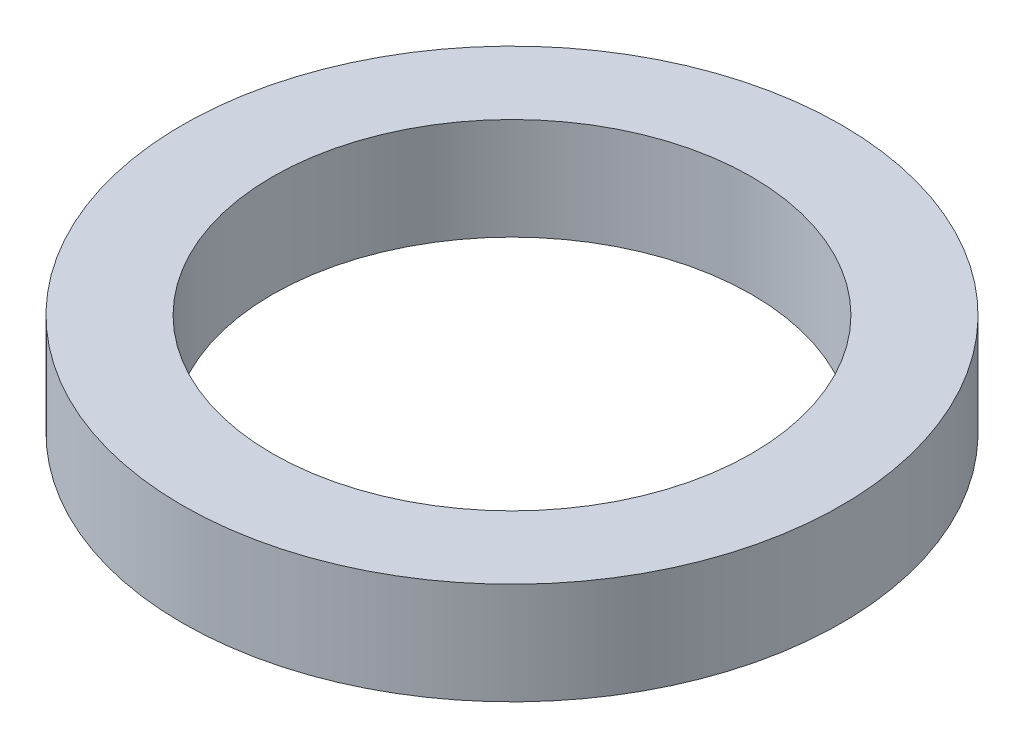
ISO-10303-21;
HEADER;
FILE_DESCRIPTION(('STEP AP214'),'2;1');
FILE_NAME('part.step','',(''),(''),'','','');
FILE_SCHEMA(('AUTOMOTIVE_DESIGN { 1 0 10303 214 1 1 1 1 }'));
ENDSEC;
DATA;
#1=APPLICATION_CONTEXT('core data for automotive mechanical design processes');
#2=APPLICATION_PROTOCOL_DEFINITION('international standard','automotive_design',2000,#1);
#3=PRODUCT_CONTEXT('',#1,'mechanical');
#4=PRODUCT('Part','Part','',(#3));
#5=PRODUCT_RELATED_PRODUCT_CATEGORY('part','',(#4));
#6=PRODUCT_DEFINITION_FORMATION('','',#4);
#7=PRODUCT_DEFINITION_CONTEXT('part definition',#1,'design');
#8=PRODUCT_DEFINITION('design','',#6,#7);
#9=PRODUCT_DEFINITION_SHAPE('','',#8);
#10=(LENGTH_UNIT() NAMED_UNIT(*) SI_UNIT(.MILLI.,.METRE.));
#11=(NAMED_UNIT(*) PLANE_ANGLE_UNIT() SI_UNIT($,.RADIAN.));
#12=(NAMED_UNIT(*) SI_UNIT($,.STERADIAN.) SOLID_ANGLE_UNIT());
#13=UNCERTAINTY_MEASURE_WITH_UNIT(LENGTH_MEASURE(1.E-05),#10,'distance_accuracy_value','');
#14=(GEOMETRIC_REPRESENTATION_CONTEXT(3) GLOBAL_UNCERTAINTY_ASSIGNED_CONTEXT((#13)) GLOBAL_UNIT_ASSIGNED_CONTEXT((#10,
#11,#12)) REPRESENTATION_CONTEXT('',''));
#15=CARTESIAN_POINT('',(0.,0.,0.));
#16=DIRECTION('',(0.,0.,1.));
#17=DIRECTION('',(1.,0.,0.));
#18=AXIS2_PLACEMENT_3D('',#15,#16,#17);
#19=CARTESIAN_POINT('',(0.,1.7,0.));
#20=DIRECTION('',(0.,1.,0.));
#21=DIRECTION('',(0.,0.,1.));
#22=AXIS2_PLACEMENT_3D('',#19,#20,#21);
#23=PLANE('',#22);
#24=CARTESIAN_POINT('',(0.,1.7,0.));
#25=DIRECTION('',(0.,1.,0.));
#26=DIRECTION('',(0.,0.,1.));
#27=AXIS2_PLACEMENT_3D('',#24,#25,#26);
#28=CIRCLE('',#27,5.5);
#29=CARTESIAN_POINT('',(0.,1.7,5.5));
#30=VERTEX_POINT('',#29);
#31=EDGE_CURVE('E10',#30,#30,#28,.T.);
#32=ORIENTED_EDGE('',*,*,#31,.T.);
#33=EDGE_LOOP('',(#32));
#34=FACE_BOUND('',#33,.T.);
#35=CARTESIAN_POINT('',(0.,1.7,0.));
#36=DIRECTION('',(0.,1.,0.));
#37=DIRECTION('',(0.,0.,1.));
#38=AXIS2_PLACEMENT_3D('',#35,#36,#37);
#39=CIRCLE('',#38,4.);
#40=CARTESIAN_POINT('',(0.,1.7,4.));
#41=VERTEX_POINT('',#40);
#42=EDGE_CURVE('E44',#41,#41,#39,.T.);
#43=ORIENTED_EDGE('',*,*,#42,.F.);
#44=EDGE_LOOP('',(#43));
#45=FACE_BOUND('',#44,.T.);
#46=ADVANCED_FACE('F33',(#34,#45),#23,.T.);
#47=CARTESIAN_POINT('',(0.,0.,0.));
#48=DIRECTION('',(0.,1.,0.));
#49=DIRECTION('',(0.,0.,1.));
#50=AXIS2_PLACEMENT_3D('',#47,#48,#49);
#51=PLANE('',#50);
#52=CARTESIAN_POINT('',(0.,0.,0.));
#53=DIRECTION('',(0.,1.,0.));
#54=DIRECTION('',(0.,0.,1.));
#55=AXIS2_PLACEMENT_3D('',#52,#53,#54);
#56=CIRCLE('',#55,5.5);
#57=CARTESIAN_POINT('',(0.,0.,5.5));
#58=VERTEX_POINT('',#57);
#59=EDGE_CURVE('E37',#58,#58,#56,.T.);
#60=ORIENTED_EDGE('',*,*,#59,.F.);
#61=EDGE_LOOP('',(#60));
#62=FACE_BOUND('',#61,.T.);
#63=CARTESIAN_POINT('',(0.,0.,0.));
#64=DIRECTION('',(0.,1.,0.));
#65=DIRECTION('',(0.,0.,1.));
#66=AXIS2_PLACEMENT_3D('',#63,#64,#65);
#67=CIRCLE('',#66,4.);
#68=CARTESIAN_POINT('',(0.,0.,4.));
#69=VERTEX_POINT('',#68);
#70=EDGE_CURVE('E46',#69,#69,#67,.T.);
#71=ORIENTED_EDGE('',*,*,#70,.T.);
#72=EDGE_LOOP('',(#71));
#73=FACE_BOUND('',#72,.T.);
#74=ADVANCED_FACE('F56',(#62,#73),#51,.F.);
#75=CARTESIAN_POINT('',(0.,1.7,0.));
#76=DIRECTION('',(0.,-1.,0.));
#77=DIRECTION('',(0.,0.,-1.));
#78=AXIS2_PLACEMENT_3D('',#75,#76,#77);
#79=CYLINDRICAL_SURFACE('',#78,5.5);
#80=ORIENTED_EDGE('',*,*,#31,.F.);
#81=EDGE_LOOP('',(#80));
#82=FACE_BOUND('',#81,.T.);
#83=ORIENTED_EDGE('',*,*,#59,.T.);
#84=EDGE_LOOP('',(#83));
#85=FACE_BOUND('',#84,.T.);
#86=ADVANCED_FACE('F35',(#82,#85),#79,.T.);
#87=CARTESIAN_POINT('',(0.,1.7,0.));
#88=DIRECTION('',(0.,-1.,0.));
#89=DIRECTION('',(0.,0.,-1.));
#90=AXIS2_PLACEMENT_3D('',#87,#88,#89);
#91=CYLINDRICAL_SURFACE('',#90,4.);
#92=ORIENTED_EDGE('',*,*,#42,.T.);
#93=EDGE_LOOP('',(#92));
#94=FACE_BOUND('',#93,.T.);
#95=ORIENTED_EDGE('',*,*,#70,.F.);
#96=EDGE_LOOP('',(#95));
#97=FACE_BOUND('',#96,.T.);
#98=ADVANCED_FACE('F52',(#94,#97),#91,.F.);
#99=CLOSED_SHELL('',(#46,#74,#86,#98));
#100=MANIFOLD_SOLID_BREP('B2',#99);
#101=ADVANCED_BREP_SHAPE_REPRESENTATION('',(#18,#100),#14);
#102=SHAPE_DEFINITION_REPRESENTATION(#9,#101);
ENDSEC;
END-ISO-10303-21;
